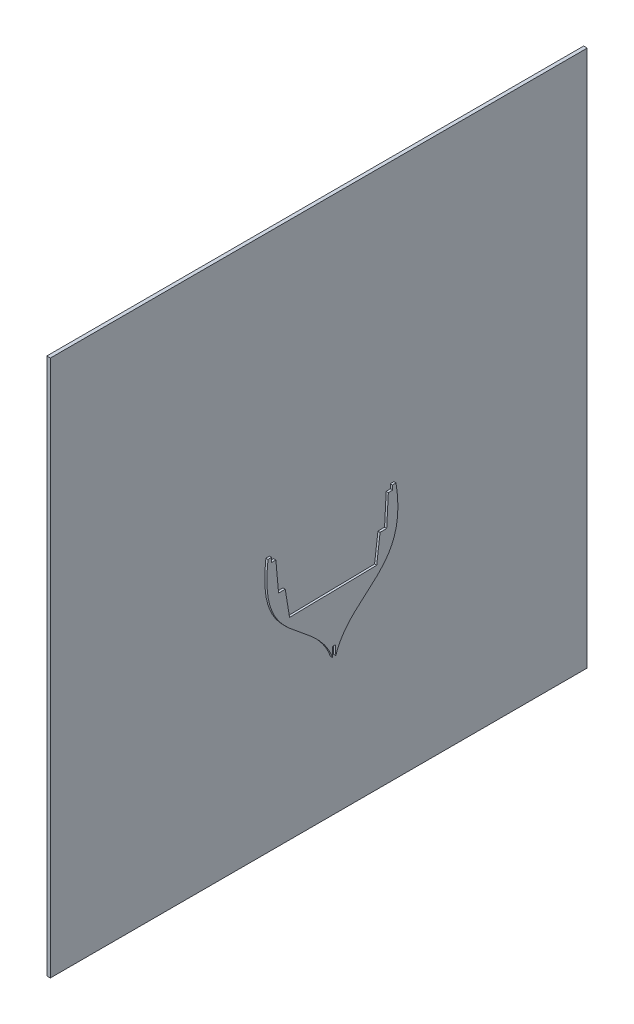
ISO-10303-21;
HEADER;
FILE_DESCRIPTION(('STEP AP214'),'2;1');
FILE_NAME('part.step','',(''),(''),'','','');
FILE_SCHEMA(('AUTOMOTIVE_DESIGN { 1 0 10303 214 1 1 1 1 }'));
ENDSEC;
DATA;
#1=APPLICATION_CONTEXT('core data for automotive mechanical design processes');
#2=APPLICATION_PROTOCOL_DEFINITION('international standard','automotive_design',2000,#1);
#3=PRODUCT_CONTEXT('',#1,'mechanical');
#4=PRODUCT('Part','Part','',(#3));
#5=PRODUCT_RELATED_PRODUCT_CATEGORY('part','',(#4));
#6=PRODUCT_DEFINITION_FORMATION('','',#4);
#7=PRODUCT_DEFINITION_CONTEXT('part definition',#1,'design');
#8=PRODUCT_DEFINITION('design','',#6,#7);
#9=PRODUCT_DEFINITION_SHAPE('','',#8);
#10=(LENGTH_UNIT() NAMED_UNIT(*) SI_UNIT(.MILLI.,.METRE.));
#11=(NAMED_UNIT(*) PLANE_ANGLE_UNIT() SI_UNIT($,.RADIAN.));
#12=(NAMED_UNIT(*) SI_UNIT($,.STERADIAN.) SOLID_ANGLE_UNIT());
#13=UNCERTAINTY_MEASURE_WITH_UNIT(LENGTH_MEASURE(1.E-05),#10,'distance_accuracy_value','');
#14=(GEOMETRIC_REPRESENTATION_CONTEXT(3) GLOBAL_UNCERTAINTY_ASSIGNED_CONTEXT((#13)) GLOBAL_UNIT_ASSIGNED_CONTEXT((#10,
#11,#12)) REPRESENTATION_CONTEXT('',''));
#15=CARTESIAN_POINT('',(0.,0.,0.));
#16=DIRECTION('',(0.,0.,1.));
#17=DIRECTION('',(1.,0.,0.));
#18=AXIS2_PLACEMENT_3D('',#15,#16,#17);
#19=CARTESIAN_POINT('',(6.,345.854889045011,185.110166407532));
#20=CARTESIAN_POINT('',(6.,92.9054641096279,216.874652949193));
#21=CARTESIAN_POINT('',(6.,167.349631387914,32.8425136547484));
#22=CARTESIAN_POINT('',(6.,16.019137781302,2.50906298483127));
#23=CARTESIAN_POINT('',(6.,0.,0.));
#24=B_SPLINE_CURVE_WITH_KNOTS('',4,(#19,#20,#21,#22,#23),.UNSPECIFIED.,.F.,.F.,(5,5),(0.,1.),.UNSPECIFIED.);
#25=DIRECTION('',(-1.,0.,0.));
#26=VECTOR('',#25,1.);
#27=SURFACE_OF_LINEAR_EXTRUSION('',#24,#26);
#28=CARTESIAN_POINT('',(0.,345.854889045011,185.110166407532));
#29=CARTESIAN_POINT('',(0.,92.9054641096279,216.874652949193));
#30=CARTESIAN_POINT('',(0.,167.349631387914,32.8425136547484));
#31=CARTESIAN_POINT('',(0.,16.019137781302,2.50906298483127));
#32=CARTESIAN_POINT('',(0.,0.,0.));
#33=B_SPLINE_CURVE_WITH_KNOTS('',4,(#28,#29,#30,#31,#32),.UNSPECIFIED.,.F.,.F.,(5,5),(0.,1.),.UNSPECIFIED.);
#34=CARTESIAN_POINT('',(0.,345.854889045011,185.110166407532));
#35=VERTEX_POINT('',#34);
#36=CARTESIAN_POINT('',(0.,18.412182380784,4.83502038094929));
#37=VERTEX_POINT('',#36);
#38=EDGE_CURVE('E191',#35,#37,#33,.T.);
#39=ORIENTED_EDGE('',*,*,#38,.T.);
#40=DIRECTION('',(1.,0.,0.));
#41=VECTOR('',#40,1.);
#42=CARTESIAN_POINT('',(0.,18.412182380784,4.83502038094929));
#43=LINE('',#42,#41);
#44=CARTESIAN_POINT('',(6.,18.412182380784,4.83502038094929));
#45=VERTEX_POINT('',#44);
#46=EDGE_CURVE('E197',#37,#45,#43,.T.);
#47=ORIENTED_EDGE('',*,*,#46,.T.);
#48=CARTESIAN_POINT('',(6.,345.854889045011,185.110166407532));
#49=VERTEX_POINT('',#48);
#50=EDGE_CURVE('E231',#49,#45,#24,.T.);
#51=ORIENTED_EDGE('',*,*,#50,.F.);
#52=DIRECTION('',(-1.,0.,0.));
#53=VECTOR('',#52,1.);
#54=CARTESIAN_POINT('',(6.,345.854889045011,185.110166407532));
#55=LINE('',#54,#53);
#56=EDGE_CURVE('E187',#49,#35,#55,.T.);
#57=ORIENTED_EDGE('',*,*,#56,.T.);
#58=EDGE_LOOP('',(#39,#47,#51,#57));
#59=FACE_BOUND('',#58,.T.);
#60=ADVANCED_FACE('F45',(#59),#27,.F.);
#61=CARTESIAN_POINT('',(6.,0.,0.));
#62=CARTESIAN_POINT('',(6.,16.0995027518845,-1.92722169462964));
#63=CARTESIAN_POINT('',(6.,168.429348892949,-26.7597507523969));
#64=CARTESIAN_POINT('',(6.,100.69946169342,-213.367426679692));
#65=CARTESIAN_POINT('',(6.,352.332448072482,-172.462239400435));
#66=B_SPLINE_CURVE_WITH_KNOTS('',4,(#61,#62,#63,#64,#65),.UNSPECIFIED.,.F.,.F.,(5,5),(0.,1.),.UNSPECIFIED.);
#67=DIRECTION('',(-1.,0.,0.));
#68=VECTOR('',#67,1.);
#69=SURFACE_OF_LINEAR_EXTRUSION('',#66,#68);
#70=CARTESIAN_POINT('',(6.,18.5752207760861,-4.16497961905071));
#71=VERTEX_POINT('',#70);
#72=CARTESIAN_POINT('',(6.,352.332448072482,-172.462239400435));
#73=VERTEX_POINT('',#72);
#74=EDGE_CURVE('E128',#71,#73,#66,.T.);
#75=ORIENTED_EDGE('',*,*,#74,.F.);
#76=DIRECTION('',(1.,0.,0.));
#77=VECTOR('',#76,1.);
#78=CARTESIAN_POINT('',(0.,18.5752207760861,-4.16497961905071));
#79=LINE('',#78,#77);
#80=CARTESIAN_POINT('',(0.,18.5752207760861,-4.16497961905071));
#81=VERTEX_POINT('',#80);
#82=EDGE_CURVE('E323',#81,#71,#79,.T.);
#83=ORIENTED_EDGE('',*,*,#82,.F.);
#84=CARTESIAN_POINT('',(0.,0.,0.));
#85=CARTESIAN_POINT('',(0.,16.0995027518845,-1.92722169462964));
#86=CARTESIAN_POINT('',(0.,168.429348892949,-26.7597507523969));
#87=CARTESIAN_POINT('',(0.,100.69946169342,-213.367426679692));
#88=CARTESIAN_POINT('',(0.,352.332448072482,-172.462239400435));
#89=B_SPLINE_CURVE_WITH_KNOTS('',4,(#84,#85,#86,#87,#88),.UNSPECIFIED.,.F.,.F.,(5,5),(0.,1.),.UNSPECIFIED.);
#90=CARTESIAN_POINT('',(0.,352.332448072482,-172.462239400435));
#91=VERTEX_POINT('',#90);
#92=EDGE_CURVE('E196',#81,#91,#89,.T.);
#93=ORIENTED_EDGE('',*,*,#92,.T.);
#94=DIRECTION('',(-1.,0.,0.));
#95=VECTOR('',#94,1.);
#96=CARTESIAN_POINT('',(6.,352.332448072482,-172.462239400435));
#97=LINE('',#96,#95);
#98=EDGE_CURVE('E13',#73,#91,#97,.T.);
#99=ORIENTED_EDGE('',*,*,#98,.F.);
#100=EDGE_LOOP('',(#75,#83,#93,#99));
#101=FACE_BOUND('',#100,.T.);
#102=ADVANCED_FACE('F335',(#101),#69,.F.);
#103=CARTESIAN_POINT('',(6.,352.332448072482,-172.462239400435));
#104=DIRECTION('',(0.,-0.999835956927465,-0.0181124055536444));
#105=DIRECTION('',(0.,0.0181124055536444,-0.999835956927465));
#106=AXIS2_PLACEMENT_3D('',#103,#104,#105);
#107=PLANE('',#106);
#108=DIRECTION('',(0.,-0.0181124055536444,0.999835956927465));
#109=VECTOR('',#108,1.);
#110=CARTESIAN_POINT('',(0.,352.332448072482,-172.462239400435));
#111=LINE('',#110,#109);
#112=CARTESIAN_POINT('',(0.,352.151294299924,-162.462239400435));
#113=VERTEX_POINT('',#112);
#114=EDGE_CURVE('E204',#91,#113,#111,.T.);
#115=ORIENTED_EDGE('',*,*,#114,.T.);
#116=DIRECTION('',(-1.,0.,0.));
#117=VECTOR('',#116,1.);
#118=CARTESIAN_POINT('',(6.,352.151294299924,-162.462239400435));
#119=LINE('',#118,#117);
#120=CARTESIAN_POINT('',(6.,352.151294299924,-162.462239400435));
#121=VERTEX_POINT('',#120);
#122=EDGE_CURVE('E53',#121,#113,#119,.T.);
#123=ORIENTED_EDGE('',*,*,#122,.F.);
#124=DIRECTION('',(0.,-0.0181124055536444,0.999835956927465));
#125=VECTOR('',#124,1.);
#126=CARTESIAN_POINT('',(6.,352.332448072482,-172.462239400435));
#127=LINE('',#126,#125);
#128=EDGE_CURVE('E317',#73,#121,#127,.T.);
#129=ORIENTED_EDGE('',*,*,#128,.F.);
#130=ORIENTED_EDGE('',*,*,#98,.T.);
#131=EDGE_LOOP('',(#115,#123,#129,#130));
#132=FACE_BOUND('',#131,.T.);
#133=ADVANCED_FACE('F338',(#132),#107,.F.);
#134=CARTESIAN_POINT('',(6.,352.151294299924,-162.462239400435));
#135=DIRECTION('',(0.,0.0615422827320705,-0.998104477214748));
#136=DIRECTION('',(0.,0.998104477214748,0.0615422827320705));
#137=AXIS2_PLACEMENT_3D('',#134,#135,#136);
#138=PLANE('',#137);
#139=DIRECTION('',(0.,-0.998104477214748,-0.0615422827320705));
#140=VECTOR('',#139,1.);
#141=CARTESIAN_POINT('',(0.,352.151294299924,-162.462239400435));
#142=LINE('',#141,#140);
#143=CARTESIAN_POINT('',(0.,339.801338052791,-163.223727317222));
#144=VERTEX_POINT('',#143);
#145=EDGE_CURVE('E209',#113,#144,#142,.T.);
#146=ORIENTED_EDGE('',*,*,#145,.T.);
#147=DIRECTION('',(-1.,0.,0.));
#148=VECTOR('',#147,1.);
#149=CARTESIAN_POINT('',(6.,339.801338052791,-163.223727317222));
#150=LINE('',#149,#148);
#151=CARTESIAN_POINT('',(6.,339.801338052791,-163.223727317222));
#152=VERTEX_POINT('',#151);
#153=EDGE_CURVE('E256',#152,#144,#150,.T.);
#154=ORIENTED_EDGE('',*,*,#153,.F.);
#155=DIRECTION('',(0.,-0.998104477214748,-0.0615422827320705));
#156=VECTOR('',#155,1.);
#157=CARTESIAN_POINT('',(6.,352.151294299924,-162.462239400435));
#158=LINE('',#157,#156);
#159=EDGE_CURVE('E265',#121,#152,#158,.T.);
#160=ORIENTED_EDGE('',*,*,#159,.F.);
#161=ORIENTED_EDGE('',*,*,#122,.T.);
#162=EDGE_LOOP('',(#146,#154,#160,#161));
#163=FACE_BOUND('',#162,.T.);
#164=ADVANCED_FACE('F263',(#163),#138,.F.);
#165=CARTESIAN_POINT('',(6.,339.801338052791,-163.223727317222));
#166=DIRECTION('',(0.,-0.999835956927465,-0.0181124055536559));
#167=DIRECTION('',(0.,0.0181124055536559,-0.999835956927465));
#168=AXIS2_PLACEMENT_3D('',#165,#166,#167);
#169=PLANE('',#168);
#170=DIRECTION('',(0.,-0.0181124055536559,0.999835956927465));
#171=VECTOR('',#170,1.);
#172=CARTESIAN_POINT('',(0.,339.801338052791,-163.223727317222));
#173=LINE('',#172,#171);
#174=CARTESIAN_POINT('',(0.,339.580236130428,-151.018520699586));
#175=VERTEX_POINT('',#174);
#176=EDGE_CURVE('E211',#144,#175,#173,.T.);
#177=ORIENTED_EDGE('',*,*,#176,.T.);
#178=DIRECTION('',(-1.,0.,0.));
#179=VECTOR('',#178,1.);
#180=CARTESIAN_POINT('',(6.,339.580236130428,-151.018520699586));
#181=LINE('',#180,#179);
#182=CARTESIAN_POINT('',(6.,339.580236130428,-151.018520699586));
#183=VERTEX_POINT('',#182);
#184=EDGE_CURVE('E253',#183,#175,#181,.T.);
#185=ORIENTED_EDGE('',*,*,#184,.F.);
#186=DIRECTION('',(0.,-0.0181124055536559,0.999835956927465));
#187=VECTOR('',#186,1.);
#188=CARTESIAN_POINT('',(6.,339.801338052791,-163.223727317222));
#189=LINE('',#188,#187);
#190=EDGE_CURVE('E287',#152,#183,#189,.T.);
#191=ORIENTED_EDGE('',*,*,#190,.F.);
#192=ORIENTED_EDGE('',*,*,#153,.T.);
#193=EDGE_LOOP('',(#177,#185,#191,#192));
#194=FACE_BOUND('',#193,.T.);
#195=ADVANCED_FACE('F278',(#194),#169,.F.);
#196=CARTESIAN_POINT('',(6.,339.580236130428,-151.018520699586));
#197=DIRECTION('',(0.,-0.0538390916893999,-0.998549624308207));
#198=DIRECTION('',(0.,0.998549624308207,-0.0538390916893999));
#199=AXIS2_PLACEMENT_3D('',#196,#197,#198);
#200=PLANE('',#199);
#201=DIRECTION('',(0.,-0.998549624308206,0.0538390916893999));
#202=VECTOR('',#201,1.);
#203=CARTESIAN_POINT('',(0.,339.580236130428,-151.018520699586));
#204=LINE('',#203,#202);
#205=CARTESIAN_POINT('',(0.,255.274664597182,-146.47299258039));
#206=VERTEX_POINT('',#205);
#207=EDGE_CURVE('E213',#175,#206,#204,.T.);
#208=ORIENTED_EDGE('',*,*,#207,.T.);
#209=DIRECTION('',(-1.,0.,0.));
#210=VECTOR('',#209,1.);
#211=CARTESIAN_POINT('',(6.,255.274664597182,-146.47299258039));
#212=LINE('',#211,#210);
#213=CARTESIAN_POINT('',(6.,255.274664597182,-146.47299258039));
#214=VERTEX_POINT('',#213);
#215=EDGE_CURVE('E250',#214,#206,#212,.T.);
#216=ORIENTED_EDGE('',*,*,#215,.F.);
#217=DIRECTION('',(0.,-0.998549624308206,0.0538390916893999));
#218=VECTOR('',#217,1.);
#219=CARTESIAN_POINT('',(6.,339.580236130428,-151.018520699586));
#220=LINE('',#219,#218);
#221=EDGE_CURVE('E284',#183,#214,#220,.T.);
#222=ORIENTED_EDGE('',*,*,#221,.F.);
#223=ORIENTED_EDGE('',*,*,#184,.T.);
#224=EDGE_LOOP('',(#208,#216,#222,#223));
#225=FACE_BOUND('',#224,.T.);
#226=ADVANCED_FACE('F282',(#225),#200,.F.);
#227=CARTESIAN_POINT('',(6.,255.274664597182,-146.47299258039));
#228=DIRECTION('',(0.,-0.999835956927465,-0.0181124055536453));
#229=DIRECTION('',(0.,0.0181124055536453,-0.999835956927465));
#230=AXIS2_PLACEMENT_3D('',#227,#228,#229);
#231=PLANE('',#230);
#232=DIRECTION('',(0.,-0.0181124055536454,0.999835956927465));
#233=VECTOR('',#232,1.);
#234=CARTESIAN_POINT('',(0.,255.274664597182,-146.47299258039));
#235=LINE('',#234,#233);
#236=CARTESIAN_POINT('',(0.,254.939924048743,-127.994738238122));
#237=VERTEX_POINT('',#236);
#238=EDGE_CURVE('E215',#206,#237,#235,.T.);
#239=ORIENTED_EDGE('',*,*,#238,.T.);
#240=DIRECTION('',(-1.,0.,0.));
#241=VECTOR('',#240,1.);
#242=CARTESIAN_POINT('',(6.,254.939924048743,-127.994738238122));
#243=LINE('',#242,#241);
#244=CARTESIAN_POINT('',(6.,254.939924048743,-127.994738238122));
#245=VERTEX_POINT('',#244);
#246=EDGE_CURVE('E247',#245,#237,#243,.T.);
#247=ORIENTED_EDGE('',*,*,#246,.F.);
#248=DIRECTION('',(0.,-0.0181124055536454,0.999835956927465));
#249=VECTOR('',#248,1.);
#250=CARTESIAN_POINT('',(6.,255.274664597182,-146.47299258039));
#251=LINE('',#250,#249);
#252=EDGE_CURVE('E286',#214,#245,#251,.T.);
#253=ORIENTED_EDGE('',*,*,#252,.F.);
#254=ORIENTED_EDGE('',*,*,#215,.T.);
#255=EDGE_LOOP('',(#239,#247,#253,#254));
#256=FACE_BOUND('',#255,.T.);
#257=ADVANCED_FACE('F348',(#256),#231,.F.);
#258=CARTESIAN_POINT('',(6.,254.939924048743,-127.994738238122));
#259=DIRECTION('',(0.,-0.125354503025121,-0.992112014125081));
#260=DIRECTION('',(0.,0.992112014125081,-0.125354503025121));
#261=AXIS2_PLACEMENT_3D('',#258,#259,#260);
#262=PLANE('',#261);
#263=DIRECTION('',(0.,-0.992112014125081,0.125354503025121));
#264=VECTOR('',#263,1.);
#265=CARTESIAN_POINT('',(0.,254.939924048743,-127.994738238122));
#266=LINE('',#265,#264);
#267=CARTESIAN_POINT('',(0.,180.005385852165,-118.526672474064));
#268=VERTEX_POINT('',#267);
#269=EDGE_CURVE('E217',#237,#268,#266,.T.);
#270=ORIENTED_EDGE('',*,*,#269,.T.);
#271=DIRECTION('',(-1.,0.,0.));
#272=VECTOR('',#271,1.);
#273=CARTESIAN_POINT('',(6.,180.005385852165,-118.526672474064));
#274=LINE('',#273,#272);
#275=CARTESIAN_POINT('',(6.,180.005385852165,-118.526672474064));
#276=VERTEX_POINT('',#275);
#277=EDGE_CURVE('E244',#276,#268,#274,.T.);
#278=ORIENTED_EDGE('',*,*,#277,.F.);
#279=DIRECTION('',(0.,-0.992112014125081,0.125354503025121));
#280=VECTOR('',#279,1.);
#281=CARTESIAN_POINT('',(6.,254.939924048743,-127.994738238122));
#282=LINE('',#281,#280);
#283=EDGE_CURVE('E289',#245,#276,#282,.T.);
#284=ORIENTED_EDGE('',*,*,#283,.F.);
#285=ORIENTED_EDGE('',*,*,#246,.T.);
#286=EDGE_LOOP('',(#270,#278,#284,#285));
#287=FACE_BOUND('',#286,.T.);
#288=ADVANCED_FACE('F351',(#287),#262,.F.);
#289=CARTESIAN_POINT('',(6.,180.005385852165,-118.526672474064));
#290=DIRECTION('',(0.,-0.999835956927465,-0.0181124055536429));
#291=DIRECTION('',(0.,0.0181124055536429,-0.999835956927466));
#292=AXIS2_PLACEMENT_3D('',#289,#290,#291);
#293=PLANE('',#292);
#294=DIRECTION('',(0.,-0.0181124055536429,0.999835956927465));
#295=VECTOR('',#294,1.);
#296=CARTESIAN_POINT('',(0.,180.005385852165,-118.526672474064));
#297=LINE('',#296,#295);
#298=CARTESIAN_POINT('',(0.,175.594379008655,124.968496366587));
#299=VERTEX_POINT('',#298);
#300=EDGE_CURVE('E219',#268,#299,#297,.T.);
#301=ORIENTED_EDGE('',*,*,#300,.T.);
#302=DIRECTION('',(-1.,0.,0.));
#303=VECTOR('',#302,1.);
#304=CARTESIAN_POINT('',(6.,175.594379008655,124.968496366587));
#305=LINE('',#304,#303);
#306=CARTESIAN_POINT('',(6.,175.594379008655,124.968496366587));
#307=VERTEX_POINT('',#306);
#308=EDGE_CURVE('E241',#307,#299,#305,.T.);
#309=ORIENTED_EDGE('',*,*,#308,.F.);
#310=DIRECTION('',(0.,-0.0181124055536429,0.999835956927465));
#311=VECTOR('',#310,1.);
#312=CARTESIAN_POINT('',(6.,180.005385852165,-118.526672474064));
#313=LINE('',#312,#311);
#314=EDGE_CURVE('E295',#276,#307,#313,.T.);
#315=ORIENTED_EDGE('',*,*,#314,.F.);
#316=ORIENTED_EDGE('',*,*,#277,.T.);
#317=EDGE_LOOP('',(#301,#309,#315,#316));
#318=FACE_BOUND('',#317,.T.);
#319=ADVANCED_FACE('F355',(#318),#293,.F.);
#320=CARTESIAN_POINT('',(6.,250.136828640148,137.14439415621));
#321=DIRECTION('',(0.,-0.161205430373838,0.986920872825165));
#322=DIRECTION('',(0.,-0.986920872825165,-0.161205430373838));
#323=AXIS2_PLACEMENT_3D('',#320,#321,#322);
#324=PLANE('',#323);
#325=DIRECTION('',(0.,0.986920872825165,0.161205430373838));
#326=VECTOR('',#325,1.);
#327=CARTESIAN_POINT('',(0.,250.136828640148,137.14439415621));
#328=LINE('',#327,#326);
#329=CARTESIAN_POINT('',(0.,250.136828640148,137.14439415621));
#330=VERTEX_POINT('',#329);
#331=EDGE_CURVE('E221',#299,#330,#328,.T.);
#332=ORIENTED_EDGE('',*,*,#331,.T.);
#333=DIRECTION('',(-1.,0.,0.));
#334=VECTOR('',#333,1.);
#335=CARTESIAN_POINT('',(6.,250.136828640148,137.14439415621));
#336=LINE('',#335,#334);
#337=CARTESIAN_POINT('',(6.,250.136828640148,137.14439415621));
#338=VERTEX_POINT('',#337);
#339=EDGE_CURVE('E238',#338,#330,#336,.T.);
#340=ORIENTED_EDGE('',*,*,#339,.F.);
#341=DIRECTION('',(0.,0.986920872825165,0.161205430373838));
#342=VECTOR('',#341,1.);
#343=CARTESIAN_POINT('',(6.,250.136828640148,137.14439415621));
#344=LINE('',#343,#342);
#345=EDGE_CURVE('E297',#307,#338,#344,.T.);
#346=ORIENTED_EDGE('',*,*,#345,.F.);
#347=ORIENTED_EDGE('',*,*,#308,.T.);
#348=EDGE_LOOP('',(#332,#340,#346,#347));
#349=FACE_BOUND('',#348,.T.);
#350=ADVANCED_FACE('F359',(#349),#324,.F.);
#351=CARTESIAN_POINT('',(6.,249.802088091709,155.622648498477));
#352=DIRECTION('',(0.,-0.999835956927465,-0.0181124055536441));
#353=DIRECTION('',(0.,0.0181124055536441,-0.999835956927465));
#354=AXIS2_PLACEMENT_3D('',#351,#352,#353);
#355=PLANE('',#354);
#356=DIRECTION('',(0.,-0.0181124055536441,0.999835956927465));
#357=VECTOR('',#356,1.);
#358=CARTESIAN_POINT('',(0.,249.802088091709,155.622648498477));
#359=LINE('',#358,#357);
#360=CARTESIAN_POINT('',(0.,249.802088091709,155.622648498477));
#361=VERTEX_POINT('',#360);
#362=EDGE_CURVE('E223',#330,#361,#359,.T.);
#363=ORIENTED_EDGE('',*,*,#362,.T.);
#364=DIRECTION('',(-1.,0.,0.));
#365=VECTOR('',#364,1.);
#366=CARTESIAN_POINT('',(6.,249.802088091709,155.622648498477));
#367=LINE('',#366,#365);
#368=CARTESIAN_POINT('',(6.,249.802088091709,155.622648498477));
#369=VERTEX_POINT('',#368);
#370=EDGE_CURVE('E235',#369,#361,#367,.T.);
#371=ORIENTED_EDGE('',*,*,#370,.F.);
#372=DIRECTION('',(0.,-0.0181124055536441,0.999835956927465));
#373=VECTOR('',#372,1.);
#374=CARTESIAN_POINT('',(6.,249.802088091709,155.622648498477));
#375=LINE('',#374,#373);
#376=EDGE_CURVE('E299',#338,#369,#375,.T.);
#377=ORIENTED_EDGE('',*,*,#376,.F.);
#378=ORIENTED_EDGE('',*,*,#339,.T.);
#379=EDGE_LOOP('',(#363,#371,#377,#378));
#380=FACE_BOUND('',#379,.T.);
#381=ADVANCED_FACE('F305',(#380),#355,.F.);
#382=CARTESIAN_POINT('',(6.,333.887711296337,163.218646636903));
#383=DIRECTION('',(0.,-0.0899701045781974,0.995944466464967));
#384=DIRECTION('',(0.,-0.995944466464967,-0.0899701045781974));
#385=AXIS2_PLACEMENT_3D('',#382,#383,#384);
#386=PLANE('',#385);
#387=DIRECTION('',(0.,0.995944466464967,0.0899701045781974));
#388=VECTOR('',#387,1.);
#389=CARTESIAN_POINT('',(0.,333.887711296337,163.218646636903));
#390=LINE('',#389,#388);
#391=CARTESIAN_POINT('',(0.,333.887711296337,163.218646636903));
#392=VERTEX_POINT('',#391);
#393=EDGE_CURVE('E225',#361,#392,#390,.T.);
#394=ORIENTED_EDGE('',*,*,#393,.T.);
#395=DIRECTION('',(-1.,0.,0.));
#396=VECTOR('',#395,1.);
#397=CARTESIAN_POINT('',(6.,333.887711296337,163.218646636903));
#398=LINE('',#397,#396);
#399=CARTESIAN_POINT('',(6.,333.887711296337,163.218646636903));
#400=VERTEX_POINT('',#399);
#401=EDGE_CURVE('E182',#400,#392,#398,.T.);
#402=ORIENTED_EDGE('',*,*,#401,.F.);
#403=DIRECTION('',(0.,0.995944466464967,0.0899701045781974));
#404=VECTOR('',#403,1.);
#405=CARTESIAN_POINT('',(6.,333.887711296337,163.218646636903));
#406=LINE('',#405,#404);
#407=EDGE_CURVE('E170',#369,#400,#406,.T.);
#408=ORIENTED_EDGE('',*,*,#407,.F.);
#409=ORIENTED_EDGE('',*,*,#370,.T.);
#410=EDGE_LOOP('',(#394,#402,#408,#409));
#411=FACE_BOUND('',#410,.T.);
#412=ADVANCED_FACE('F309',(#411),#386,.F.);
#413=CARTESIAN_POINT('',(6.,333.666609373974,175.423853254539));
#414=DIRECTION('',(0.,-0.999835956927465,-0.0181124055536375));
#415=DIRECTION('',(0.,0.0181124055536375,-0.999835956927466));
#416=AXIS2_PLACEMENT_3D('',#413,#414,#415);
#417=PLANE('',#416);
#418=DIRECTION('',(0.,-0.0181124055536375,0.999835956927465));
#419=VECTOR('',#418,1.);
#420=CARTESIAN_POINT('',(0.,333.666609373974,175.423853254539));
#421=LINE('',#420,#419);
#422=CARTESIAN_POINT('',(0.,333.666609373974,175.423853254539));
#423=VERTEX_POINT('',#422);
#424=EDGE_CURVE('E179',#392,#423,#421,.T.);
#425=ORIENTED_EDGE('',*,*,#424,.T.);
#426=DIRECTION('',(-1.,0.,0.));
#427=VECTOR('',#426,1.);
#428=CARTESIAN_POINT('',(6.,333.666609373974,175.423853254539));
#429=LINE('',#428,#427);
#430=CARTESIAN_POINT('',(6.,333.666609373974,175.423853254539));
#431=VERTEX_POINT('',#430);
#432=EDGE_CURVE('E176',#431,#423,#429,.T.);
#433=ORIENTED_EDGE('',*,*,#432,.F.);
#434=DIRECTION('',(0.,-0.0181124055536375,0.999835956927465));
#435=VECTOR('',#434,1.);
#436=CARTESIAN_POINT('',(6.,333.666609373974,175.423853254539));
#437=LINE('',#436,#435);
#438=EDGE_CURVE('E163',#400,#431,#437,.T.);
#439=ORIENTED_EDGE('',*,*,#438,.F.);
#440=ORIENTED_EDGE('',*,*,#401,.T.);
#441=EDGE_LOOP('',(#425,#433,#439,#440));
#442=FACE_BOUND('',#441,.T.);
#443=ADVANCED_FACE('F177',(#442),#417,.F.);
#444=CARTESIAN_POINT('',(6.,346.036042817569,175.110166407532));
#445=DIRECTION('',(0.,0.0253516887165528,0.999678594288794));
#446=DIRECTION('',(0.,-0.999678594288794,0.0253516887165528));
#447=AXIS2_PLACEMENT_3D('',#444,#445,#446);
#448=PLANE('',#447);
#449=DIRECTION('',(0.,0.999678594288794,-0.0253516887165528));
#450=VECTOR('',#449,1.);
#451=CARTESIAN_POINT('',(0.,346.036042817569,175.110166407532));
#452=LINE('',#451,#450);
#453=CARTESIAN_POINT('',(0.,346.036042817569,175.110166407532));
#454=VERTEX_POINT('',#453);
#455=EDGE_CURVE('E228',#423,#454,#452,.T.);
#456=ORIENTED_EDGE('',*,*,#455,.T.);
#457=DIRECTION('',(-1.,0.,0.));
#458=VECTOR('',#457,1.);
#459=CARTESIAN_POINT('',(6.,346.036042817569,175.110166407532));
#460=LINE('',#459,#458);
#461=CARTESIAN_POINT('',(6.,346.036042817569,175.110166407532));
#462=VERTEX_POINT('',#461);
#463=EDGE_CURVE('E183',#462,#454,#460,.T.);
#464=ORIENTED_EDGE('',*,*,#463,.F.);
#465=DIRECTION('',(0.,0.999678594288794,-0.0253516887165528));
#466=VECTOR('',#465,1.);
#467=CARTESIAN_POINT('',(6.,346.036042817569,175.110166407532));
#468=LINE('',#467,#466);
#469=EDGE_CURVE('E167',#431,#462,#468,.T.);
#470=ORIENTED_EDGE('',*,*,#469,.F.);
#471=ORIENTED_EDGE('',*,*,#432,.T.);
#472=EDGE_LOOP('',(#456,#464,#470,#471));
#473=FACE_BOUND('',#472,.T.);
#474=ADVANCED_FACE('F185',(#473),#448,.F.);
#475=CARTESIAN_POINT('',(6.,345.854889045011,185.110166407532));
#476=DIRECTION('',(0.,-0.999835956927465,-0.0181124055536559));
#477=DIRECTION('',(0.,0.0181124055536559,-0.999835956927465));
#478=AXIS2_PLACEMENT_3D('',#475,#476,#477);
#479=PLANE('',#478);
#480=DIRECTION('',(0.,-0.0181124055536559,0.999835956927465));
#481=VECTOR('',#480,1.);
#482=CARTESIAN_POINT('',(0.,345.854889045011,185.110166407532));
#483=LINE('',#482,#481);
#484=EDGE_CURVE('E120',#454,#35,#483,.T.);
#485=ORIENTED_EDGE('',*,*,#484,.T.);
#486=ORIENTED_EDGE('',*,*,#56,.F.);
#487=DIRECTION('',(0.,-0.0181124055536559,0.999835956927465));
#488=VECTOR('',#487,1.);
#489=CARTESIAN_POINT('',(6.,345.854889045011,185.110166407532));
#490=LINE('',#489,#488);
#491=EDGE_CURVE('E69',#462,#49,#490,.T.);
#492=ORIENTED_EDGE('',*,*,#491,.F.);
#493=ORIENTED_EDGE('',*,*,#463,.T.);
#494=EDGE_LOOP('',(#485,#486,#492,#493));
#495=FACE_BOUND('',#494,.T.);
#496=ADVANCED_FACE('F311',(#495),#479,.F.);
#497=CARTESIAN_POINT('',(6.,111.603192808513,78.7312570045074));
#498=DIRECTION('',(-1.,0.,0.));
#499=DIRECTION('',(0.,0.,1.));
#500=AXIS2_PLACEMENT_3D('',#497,#498,#499);
#501=PLANE('',#500);
#502=ORIENTED_EDGE('',*,*,#50,.T.);
#503=DIRECTION('',(0.,-0.999835956927465,-0.0181124055536429));
#504=VECTOR('',#503,1.);
#505=CARTESIAN_POINT('',(6.,18.412182380784,4.83502038094929));
#506=LINE('',#505,#504);
#507=CARTESIAN_POINT('',(6.,45.412182380784,5.32413556685557));
#508=VERTEX_POINT('',#507);
#509=EDGE_CURVE('E511',#508,#45,#506,.T.);
#510=ORIENTED_EDGE('',*,*,#509,.F.);
#511=DIRECTION('',(0.,-0.0181124055536438,0.999835956927465));
#512=VECTOR('',#511,1.);
#513=CARTESIAN_POINT('',(6.,45.412182380784,5.32413556685557));
#514=LINE('',#513,#512);
#515=CARTESIAN_POINT('',(6.,45.5752207760861,-3.67586443314443));
#516=VERTEX_POINT('',#515);
#517=EDGE_CURVE('E519',#516,#508,#514,.T.);
#518=ORIENTED_EDGE('',*,*,#517,.F.);
#519=DIRECTION('',(0.,0.999835956927465,0.0181124055536428));
#520=VECTOR('',#519,1.);
#521=CARTESIAN_POINT('',(6.,45.5752207760861,-3.67586443314443));
#522=LINE('',#521,#520);
#523=EDGE_CURVE('E523',#71,#516,#522,.T.);
#524=ORIENTED_EDGE('',*,*,#523,.F.);
#525=ORIENTED_EDGE('',*,*,#74,.T.);
#526=ORIENTED_EDGE('',*,*,#128,.T.);
#527=ORIENTED_EDGE('',*,*,#159,.T.);
#528=ORIENTED_EDGE('',*,*,#190,.T.);
#529=ORIENTED_EDGE('',*,*,#221,.T.);
#530=ORIENTED_EDGE('',*,*,#252,.T.);
#531=ORIENTED_EDGE('',*,*,#283,.T.);
#532=ORIENTED_EDGE('',*,*,#314,.T.);
#533=ORIENTED_EDGE('',*,*,#345,.T.);
#534=ORIENTED_EDGE('',*,*,#376,.T.);
#535=ORIENTED_EDGE('',*,*,#407,.T.);
#536=ORIENTED_EDGE('',*,*,#438,.T.);
#537=ORIENTED_EDGE('',*,*,#469,.T.);
#538=ORIENTED_EDGE('',*,*,#491,.T.);
#539=EDGE_LOOP('',(#502,#510,#518,#524,#525,#526,#527,#528,#529,#530,#531,#532,#533,#534,#535,
#536,#537,#538));
#540=FACE_BOUND('',#539,.T.);
#541=ADVANCED_FACE('F165',(#540),#501,.F.);
#542=CARTESIAN_POINT('',(0.,111.603192808513,78.7312570045074));
#543=DIRECTION('',(-1.,0.,0.));
#544=DIRECTION('',(0.,0.,1.));
#545=AXIS2_PLACEMENT_3D('',#542,#543,#544);
#546=PLANE('',#545);
#547=DIRECTION('',(0.,-0.999835956927465,-0.0181124055536429));
#548=VECTOR('',#547,1.);
#549=CARTESIAN_POINT('',(0.,18.412182380784,4.83502038094929));
#550=LINE('',#549,#548);
#551=CARTESIAN_POINT('',(0.,45.412182380784,5.32413556685557));
#552=VERTEX_POINT('',#551);
#553=EDGE_CURVE('E532',#552,#37,#550,.T.);
#554=ORIENTED_EDGE('',*,*,#553,.T.);
#555=ORIENTED_EDGE('',*,*,#38,.F.);
#556=ORIENTED_EDGE('',*,*,#484,.F.);
#557=ORIENTED_EDGE('',*,*,#455,.F.);
#558=ORIENTED_EDGE('',*,*,#424,.F.);
#559=ORIENTED_EDGE('',*,*,#393,.F.);
#560=ORIENTED_EDGE('',*,*,#362,.F.);
#561=ORIENTED_EDGE('',*,*,#331,.F.);
#562=ORIENTED_EDGE('',*,*,#300,.F.);
#563=ORIENTED_EDGE('',*,*,#269,.F.);
#564=ORIENTED_EDGE('',*,*,#238,.F.);
#565=ORIENTED_EDGE('',*,*,#207,.F.);
#566=ORIENTED_EDGE('',*,*,#176,.F.);
#567=ORIENTED_EDGE('',*,*,#145,.F.);
#568=ORIENTED_EDGE('',*,*,#114,.F.);
#569=ORIENTED_EDGE('',*,*,#92,.F.);
#570=DIRECTION('',(0.,0.999835956927465,0.0181124055536428));
#571=VECTOR('',#570,1.);
#572=CARTESIAN_POINT('',(0.,45.5752207760861,-3.67586443314443));
#573=LINE('',#572,#571);
#574=CARTESIAN_POINT('',(0.,45.5752207760861,-3.67586443314441));
#575=VERTEX_POINT('',#574);
#576=EDGE_CURVE('E518',#81,#575,#573,.T.);
#577=ORIENTED_EDGE('',*,*,#576,.T.);
#578=DIRECTION('',(0.,-0.0181124055536438,0.999835956927465));
#579=VECTOR('',#578,1.);
#580=CARTESIAN_POINT('',(0.,45.412182380784,5.32413556685557));
#581=LINE('',#580,#579);
#582=EDGE_CURVE('E60',#575,#552,#581,.T.);
#583=ORIENTED_EDGE('',*,*,#582,.T.);
#584=EDGE_LOOP('',(#554,#555,#556,#557,#558,#559,#560,#561,#562,#563,#564,#565,#566,#567,#568,
#569,#577,#583));
#585=FACE_BOUND('',#584,.T.);
#586=ADVANCED_FACE('F272',(#585),#546,.T.);
#587=CARTESIAN_POINT('',(0.,18.412182380784,4.83502038094929));
#588=DIRECTION('',(0.,-0.0181124055536429,0.999835956927465));
#589=DIRECTION('',(0.,-0.999835956927466,-0.0181124055536429));
#590=AXIS2_PLACEMENT_3D('',#587,#588,#589);
#591=PLANE('',#590);
#592=ORIENTED_EDGE('',*,*,#509,.T.);
#593=ORIENTED_EDGE('',*,*,#46,.F.);
#594=ORIENTED_EDGE('',*,*,#553,.F.);
#595=DIRECTION('',(1.,0.,0.));
#596=VECTOR('',#595,1.);
#597=CARTESIAN_POINT('',(0.,45.412182380784,5.32413556685557));
#598=LINE('',#597,#596);
#599=EDGE_CURVE('E514',#552,#508,#598,.T.);
#600=ORIENTED_EDGE('',*,*,#599,.T.);
#601=EDGE_LOOP('',(#592,#593,#594,#600));
#602=FACE_BOUND('',#601,.T.);
#603=ADVANCED_FACE('F376',(#602),#591,.F.);
#604=CARTESIAN_POINT('',(0.,45.412182380784,5.32413556685557));
#605=DIRECTION('',(0.,0.999835956927465,0.0181124055536438));
#606=DIRECTION('',(0.,-0.0181124055536438,0.999835956927466));
#607=AXIS2_PLACEMENT_3D('',#604,#605,#606);
#608=PLANE('',#607);
#609=ORIENTED_EDGE('',*,*,#517,.T.);
#610=ORIENTED_EDGE('',*,*,#599,.F.);
#611=ORIENTED_EDGE('',*,*,#582,.F.);
#612=DIRECTION('',(1.,0.,0.));
#613=VECTOR('',#612,1.);
#614=CARTESIAN_POINT('',(0.,45.5752207760861,-3.67586443314443));
#615=LINE('',#614,#613);
#616=EDGE_CURVE('E528',#575,#516,#615,.T.);
#617=ORIENTED_EDGE('',*,*,#616,.T.);
#618=EDGE_LOOP('',(#609,#610,#611,#617));
#619=FACE_BOUND('',#618,.T.);
#620=ADVANCED_FACE('F382',(#619),#608,.F.);
#621=CARTESIAN_POINT('',(0.,45.5752207760861,-3.67586443314443));
#622=DIRECTION('',(0.,0.0181124055536428,-0.999835956927465));
#623=DIRECTION('',(0.,0.999835956927466,0.0181124055536428));
#624=AXIS2_PLACEMENT_3D('',#621,#622,#623);
#625=PLANE('',#624);
#626=ORIENTED_EDGE('',*,*,#523,.T.);
#627=ORIENTED_EDGE('',*,*,#616,.F.);
#628=ORIENTED_EDGE('',*,*,#576,.F.);
#629=ORIENTED_EDGE('',*,*,#82,.T.);
#630=EDGE_LOOP('',(#626,#627,#628,#629));
#631=FACE_BOUND('',#630,.T.);
#632=ADVANCED_FACE('F379',(#631),#625,.F.);
#633=CLOSED_SHELL('',(#60,#102,#133,#164,#195,#226,#257,#288,#319,#350,#381,#412,#443,#474,#496,
#541,#586,#603,#620,#632));
#634=MANIFOLD_SOLID_BREP('B2',#633);
#635=CARTESIAN_POINT('',(-10.,0.,0.));
#636=DIRECTION('',(-1.,0.,0.));
#637=DIRECTION('',(0.,0.,1.));
#638=AXIS2_PLACEMENT_3D('',#635,#636,#637);
#639=PLANE('',#638);
#640=DIRECTION('',(0.,0.,-1.));
#641=VECTOR('',#640,1.);
#642=CARTESIAN_POINT('',(-10.,-378.710653275796,777.274991403029));
#643=LINE('',#642,#641);
#644=CARTESIAN_POINT('',(-10.,-378.710653275796,777.274991403029));
#645=VERTEX_POINT('',#644);
#646=CARTESIAN_POINT('',(-10.,-378.710653275796,-722.725008596971));
#647=VERTEX_POINT('',#646);
#648=EDGE_CURVE('E565',#645,#647,#643,.T.);
#649=ORIENTED_EDGE('',*,*,#648,.T.);
#650=DIRECTION('',(0.,-1.,0.));
#651=VECTOR('',#650,1.);
#652=CARTESIAN_POINT('',(-10.,1121.2893467242,-722.725008596971));
#653=LINE('',#652,#651);
#654=CARTESIAN_POINT('',(-10.,1121.2893467242,-722.725008596971));
#655=VERTEX_POINT('',#654);
#656=EDGE_CURVE('E599',#655,#647,#653,.T.);
#657=ORIENTED_EDGE('',*,*,#656,.F.);
#658=DIRECTION('',(0.,0.,-1.));
#659=VECTOR('',#658,1.);
#660=CARTESIAN_POINT('',(-10.,1121.2893467242,777.274991403029));
#661=LINE('',#660,#659);
#662=CARTESIAN_POINT('',(-10.,1121.2893467242,777.274991403029));
#663=VERTEX_POINT('',#662);
#664=EDGE_CURVE('E596',#663,#655,#661,.T.);
#665=ORIENTED_EDGE('',*,*,#664,.F.);
#666=DIRECTION('',(0.,-1.,0.));
#667=VECTOR('',#666,1.);
#668=CARTESIAN_POINT('',(-10.,1121.2893467242,777.274991403029));
#669=LINE('',#668,#667);
#670=EDGE_CURVE('E593',#663,#645,#669,.T.);
#671=ORIENTED_EDGE('',*,*,#670,.T.);
#672=EDGE_LOOP('',(#649,#657,#665,#671));
#673=FACE_BOUND('',#672,.T.);
#674=ADVANCED_FACE('F556',(#673),#639,.F.);
#675=CARTESIAN_POINT('',(-20.,0.,0.));
#676=DIRECTION('',(-1.,0.,0.));
#677=DIRECTION('',(0.,0.,1.));
#678=AXIS2_PLACEMENT_3D('',#675,#676,#677);
#679=PLANE('',#678);
#680=DIRECTION('',(0.,0.,-1.));
#681=VECTOR('',#680,1.);
#682=CARTESIAN_POINT('',(-20.,-378.710653275796,777.274991403029));
#683=LINE('',#682,#681);
#684=CARTESIAN_POINT('',(-20.,-378.710653275796,777.274991403029));
#685=VERTEX_POINT('',#684);
#686=CARTESIAN_POINT('',(-20.,-378.710653275796,-722.725008596971));
#687=VERTEX_POINT('',#686);
#688=EDGE_CURVE('E43',#685,#687,#683,.T.);
#689=ORIENTED_EDGE('',*,*,#688,.F.);
#690=DIRECTION('',(0.,-1.,0.));
#691=VECTOR('',#690,1.);
#692=CARTESIAN_POINT('',(-20.,1121.2893467242,777.274991403029));
#693=LINE('',#692,#691);
#694=CARTESIAN_POINT('',(-20.,1121.2893467242,777.274991403029));
#695=VERTEX_POINT('',#694);
#696=EDGE_CURVE('E612',#695,#685,#693,.T.);
#697=ORIENTED_EDGE('',*,*,#696,.F.);
#698=DIRECTION('',(0.,0.,-1.));
#699=VECTOR('',#698,1.);
#700=CARTESIAN_POINT('',(-20.,1121.2893467242,777.274991403029));
#701=LINE('',#700,#699);
#702=CARTESIAN_POINT('',(-20.,1121.2893467242,-722.725008596971));
#703=VERTEX_POINT('',#702);
#704=EDGE_CURVE('E603',#695,#703,#701,.T.);
#705=ORIENTED_EDGE('',*,*,#704,.T.);
#706=DIRECTION('',(0.,-1.,0.));
#707=VECTOR('',#706,1.);
#708=CARTESIAN_POINT('',(-20.,1121.2893467242,-722.725008596971));
#709=LINE('',#708,#707);
#710=EDGE_CURVE('E574',#703,#687,#709,.T.);
#711=ORIENTED_EDGE('',*,*,#710,.T.);
#712=EDGE_LOOP('',(#689,#697,#705,#711));
#713=FACE_BOUND('',#712,.T.);
#714=ADVANCED_FACE('F652',(#713),#679,.T.);
#715=CARTESIAN_POINT('',(-20.,1121.2893467242,777.274991403029));
#716=DIRECTION('',(0.,0.,1.));
#717=DIRECTION('',(1.,0.,0.));
#718=AXIS2_PLACEMENT_3D('',#715,#716,#717);
#719=PLANE('',#718);
#720=ORIENTED_EDGE('',*,*,#670,.F.);
#721=DIRECTION('',(1.,0.,0.));
#722=VECTOR('',#721,1.);
#723=CARTESIAN_POINT('',(-20.,1121.2893467242,777.274991403029));
#724=LINE('',#723,#722);
#725=EDGE_CURVE('E608',#695,#663,#724,.T.);
#726=ORIENTED_EDGE('',*,*,#725,.F.);
#727=ORIENTED_EDGE('',*,*,#696,.T.);
#728=DIRECTION('',(1.,0.,0.));
#729=VECTOR('',#728,1.);
#730=CARTESIAN_POINT('',(-20.,-378.710653275796,777.274991403029));
#731=LINE('',#730,#729);
#732=EDGE_CURVE('E604',#685,#645,#731,.T.);
#733=ORIENTED_EDGE('',*,*,#732,.T.);
#734=EDGE_LOOP('',(#720,#726,#727,#733));
#735=FACE_BOUND('',#734,.T.);
#736=ADVANCED_FACE('F613',(#735),#719,.T.);
#737=CARTESIAN_POINT('',(-20.,-378.710653275796,777.274991403029));
#738=DIRECTION('',(0.,-1.,0.));
#739=DIRECTION('',(0.,0.,-1.));
#740=AXIS2_PLACEMENT_3D('',#737,#738,#739);
#741=PLANE('',#740);
#742=ORIENTED_EDGE('',*,*,#648,.F.);
#743=ORIENTED_EDGE('',*,*,#732,.F.);
#744=ORIENTED_EDGE('',*,*,#688,.T.);
#745=DIRECTION('',(1.,0.,0.));
#746=VECTOR('',#745,1.);
#747=CARTESIAN_POINT('',(-20.,-378.710653275796,-722.725008596971));
#748=LINE('',#747,#746);
#749=EDGE_CURVE('E624',#687,#647,#748,.T.);
#750=ORIENTED_EDGE('',*,*,#749,.T.);
#751=EDGE_LOOP('',(#742,#743,#744,#750));
#752=FACE_BOUND('',#751,.T.);
#753=ADVANCED_FACE('F654',(#752),#741,.T.);
#754=CARTESIAN_POINT('',(-20.,1121.2893467242,777.274991403029));
#755=DIRECTION('',(0.,-1.,0.));
#756=DIRECTION('',(0.,0.,-1.));
#757=AXIS2_PLACEMENT_3D('',#754,#755,#756);
#758=PLANE('',#757);
#759=ORIENTED_EDGE('',*,*,#664,.T.);
#760=DIRECTION('',(1.,0.,0.));
#761=VECTOR('',#760,1.);
#762=CARTESIAN_POINT('',(-20.,1121.2893467242,-722.725008596971));
#763=LINE('',#762,#761);
#764=EDGE_CURVE('E628',#703,#655,#763,.T.);
#765=ORIENTED_EDGE('',*,*,#764,.F.);
#766=ORIENTED_EDGE('',*,*,#704,.F.);
#767=ORIENTED_EDGE('',*,*,#725,.T.);
#768=EDGE_LOOP('',(#759,#765,#766,#767));
#769=FACE_BOUND('',#768,.T.);
#770=ADVANCED_FACE('F609',(#769),#758,.F.);
#771=CARTESIAN_POINT('',(-20.,1121.2893467242,-722.725008596971));
#772=DIRECTION('',(0.,0.,1.));
#773=DIRECTION('',(1.,0.,0.));
#774=AXIS2_PLACEMENT_3D('',#771,#772,#773);
#775=PLANE('',#774);
#776=ORIENTED_EDGE('',*,*,#656,.T.);
#777=ORIENTED_EDGE('',*,*,#749,.F.);
#778=ORIENTED_EDGE('',*,*,#710,.F.);
#779=ORIENTED_EDGE('',*,*,#764,.T.);
#780=EDGE_LOOP('',(#776,#777,#778,#779));
#781=FACE_BOUND('',#780,.T.);
#782=ADVANCED_FACE('F639',(#781),#775,.F.);
#783=CLOSED_SHELL('',(#674,#714,#736,#753,#770,#782));
#784=MANIFOLD_SOLID_BREP('B7_NOT_SHOWN',#783);
#785=ADVANCED_BREP_SHAPE_REPRESENTATION('',(#18,#634,#784),#14);
#786=SHAPE_DEFINITION_REPRESENTATION(#9,#785);
ENDSEC;
END-ISO-10303-21;
